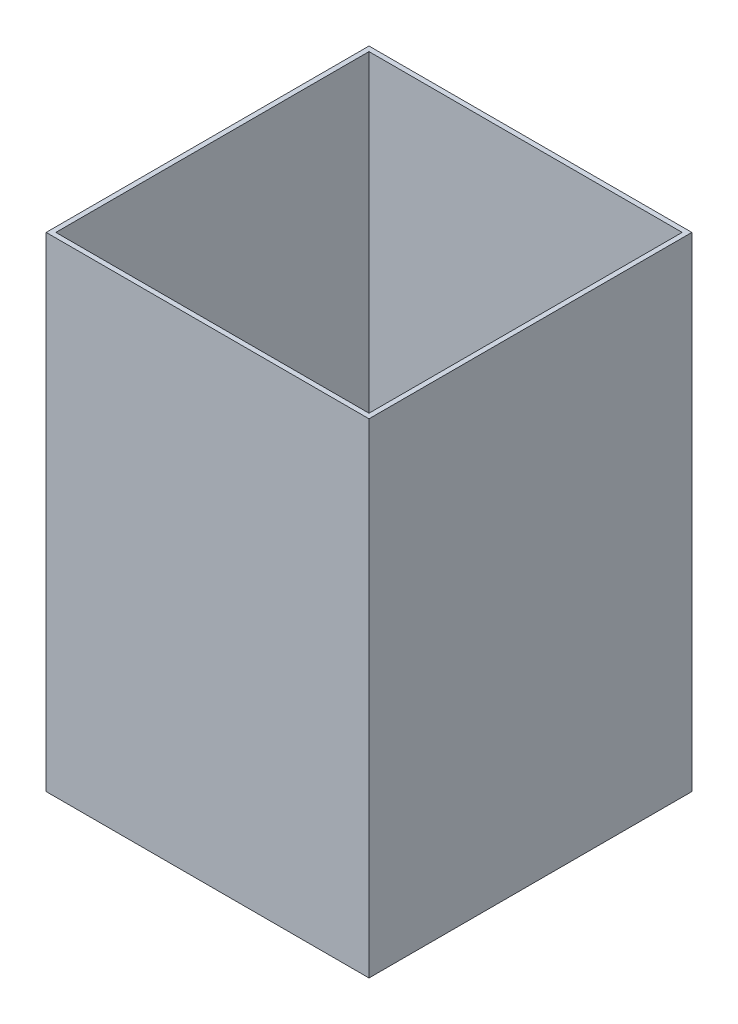
ISO-10303-21;
HEADER;
FILE_DESCRIPTION(('STEP AP214'),'2;1');
FILE_NAME('part.step','',(''),(''),'','','');
FILE_SCHEMA(('AUTOMOTIVE_DESIGN { 1 0 10303 214 1 1 1 1 }'));
ENDSEC;
DATA;
#1=APPLICATION_CONTEXT('core data for automotive mechanical design processes');
#2=APPLICATION_PROTOCOL_DEFINITION('international standard','automotive_design',2000,#1);
#3=PRODUCT_CONTEXT('',#1,'mechanical');
#4=PRODUCT('Part','Part','',(#3));
#5=PRODUCT_RELATED_PRODUCT_CATEGORY('part','',(#4));
#6=PRODUCT_DEFINITION_FORMATION('','',#4);
#7=PRODUCT_DEFINITION_CONTEXT('part definition',#1,'design');
#8=PRODUCT_DEFINITION('design','',#6,#7);
#9=PRODUCT_DEFINITION_SHAPE('','',#8);
#10=(LENGTH_UNIT() NAMED_UNIT(*) SI_UNIT(.MILLI.,.METRE.));
#11=(NAMED_UNIT(*) PLANE_ANGLE_UNIT() SI_UNIT($,.RADIAN.));
#12=(NAMED_UNIT(*) SI_UNIT($,.STERADIAN.) SOLID_ANGLE_UNIT());
#13=UNCERTAINTY_MEASURE_WITH_UNIT(LENGTH_MEASURE(1.E-05),#10,'distance_accuracy_value','');
#14=(GEOMETRIC_REPRESENTATION_CONTEXT(3) GLOBAL_UNCERTAINTY_ASSIGNED_CONTEXT((#13)) GLOBAL_UNIT_ASSIGNED_CONTEXT((#10,
#11,#12)) REPRESENTATION_CONTEXT('',''));
#15=CARTESIAN_POINT('',(0.,0.,0.));
#16=DIRECTION('',(0.,0.,1.));
#17=DIRECTION('',(1.,0.,0.));
#18=AXIS2_PLACEMENT_3D('',#15,#16,#17);
#19=CARTESIAN_POINT('',(0.,150.,0.));
#20=DIRECTION('',(0.,-1.,0.));
#21=DIRECTION('',(0.,0.,-1.));
#22=AXIS2_PLACEMENT_3D('',#19,#20,#21);
#23=PLANE('',#22);
#24=DIRECTION('',(0.,0.,-1.));
#25=VECTOR('',#24,1.);
#26=CARTESIAN_POINT('',(50.,150.,50.));
#27=LINE('',#26,#25);
#28=CARTESIAN_POINT('',(50.,150.,50.));
#29=VERTEX_POINT('',#28);
#30=CARTESIAN_POINT('',(50.,150.,-50.));
#31=VERTEX_POINT('',#30);
#32=EDGE_CURVE('E133',#29,#31,#27,.T.);
#33=ORIENTED_EDGE('',*,*,#32,.T.);
#34=DIRECTION('',(-1.,0.,0.));
#35=VECTOR('',#34,1.);
#36=CARTESIAN_POINT('',(-50.,150.,-50.));
#37=LINE('',#36,#35);
#38=CARTESIAN_POINT('',(-50.,150.,-50.));
#39=VERTEX_POINT('',#38);
#40=EDGE_CURVE('E136',#31,#39,#37,.T.);
#41=ORIENTED_EDGE('',*,*,#40,.T.);
#42=DIRECTION('',(0.,0.,1.));
#43=VECTOR('',#42,1.);
#44=CARTESIAN_POINT('',(-50.,150.,50.));
#45=LINE('',#44,#43);
#46=CARTESIAN_POINT('',(-50.,150.,50.));
#47=VERTEX_POINT('',#46);
#48=EDGE_CURVE('E139',#39,#47,#45,.T.);
#49=ORIENTED_EDGE('',*,*,#48,.T.);
#50=DIRECTION('',(1.,0.,0.));
#51=VECTOR('',#50,1.);
#52=CARTESIAN_POINT('',(-50.,150.,50.));
#53=LINE('',#52,#51);
#54=EDGE_CURVE('E141',#47,#29,#53,.T.);
#55=ORIENTED_EDGE('',*,*,#54,.T.);
#56=EDGE_LOOP('',(#33,#41,#49,#55));
#57=FACE_BOUND('',#56,.T.);
#58=DIRECTION('',(0.,0.,-1.));
#59=VECTOR('',#58,1.);
#60=CARTESIAN_POINT('',(48.5,150.,-48.5));
#61=LINE('',#60,#59);
#62=CARTESIAN_POINT('',(48.5,150.,48.5));
#63=VERTEX_POINT('',#62);
#64=CARTESIAN_POINT('',(48.5,150.,-48.5));
#65=VERTEX_POINT('',#64);
#66=EDGE_CURVE('E97',#63,#65,#61,.T.);
#67=ORIENTED_EDGE('',*,*,#66,.F.);
#68=DIRECTION('',(1.,0.,0.));
#69=VECTOR('',#68,1.);
#70=CARTESIAN_POINT('',(-48.5,150.,48.5));
#71=LINE('',#70,#69);
#72=CARTESIAN_POINT('',(-48.5,150.,48.5));
#73=VERTEX_POINT('',#72);
#74=EDGE_CURVE('E119',#73,#63,#71,.T.);
#75=ORIENTED_EDGE('',*,*,#74,.F.);
#76=DIRECTION('',(0.,0.,1.));
#77=VECTOR('',#76,1.);
#78=CARTESIAN_POINT('',(-48.5,150.,-48.5));
#79=LINE('',#78,#77);
#80=CARTESIAN_POINT('',(-48.5,150.,-48.5));
#81=VERTEX_POINT('',#80);
#82=EDGE_CURVE('E117',#81,#73,#79,.T.);
#83=ORIENTED_EDGE('',*,*,#82,.F.);
#84=DIRECTION('',(-1.,0.,0.));
#85=VECTOR('',#84,1.);
#86=CARTESIAN_POINT('',(-48.5,150.,-48.5));
#87=LINE('',#86,#85);
#88=EDGE_CURVE('E105',#65,#81,#87,.T.);
#89=ORIENTED_EDGE('',*,*,#88,.F.);
#90=EDGE_LOOP('',(#67,#75,#83,#89));
#91=FACE_BOUND('',#90,.T.);
#92=ADVANCED_FACE('F32',(#57,#91),#23,.F.);
#93=CARTESIAN_POINT('',(0.,0.,0.));
#94=DIRECTION('',(0.,-1.,0.));
#95=DIRECTION('',(0.,0.,-1.));
#96=AXIS2_PLACEMENT_3D('',#93,#94,#95);
#97=PLANE('',#96);
#98=DIRECTION('',(0.,0.,-1.));
#99=VECTOR('',#98,1.);
#100=CARTESIAN_POINT('',(50.,0.,50.));
#101=LINE('',#100,#99);
#102=CARTESIAN_POINT('',(50.,0.,50.));
#103=VERTEX_POINT('',#102);
#104=CARTESIAN_POINT('',(50.,0.,-50.));
#105=VERTEX_POINT('',#104);
#106=EDGE_CURVE('E113',#103,#105,#101,.T.);
#107=ORIENTED_EDGE('',*,*,#106,.F.);
#108=DIRECTION('',(1.,0.,0.));
#109=VECTOR('',#108,1.);
#110=CARTESIAN_POINT('',(-50.,0.,50.));
#111=LINE('',#110,#109);
#112=CARTESIAN_POINT('',(-50.,0.,50.));
#113=VERTEX_POINT('',#112);
#114=EDGE_CURVE('E137',#113,#103,#111,.T.);
#115=ORIENTED_EDGE('',*,*,#114,.F.);
#116=DIRECTION('',(0.,0.,1.));
#117=VECTOR('',#116,1.);
#118=CARTESIAN_POINT('',(-50.,0.,50.));
#119=LINE('',#118,#117);
#120=CARTESIAN_POINT('',(-50.,0.,-50.));
#121=VERTEX_POINT('',#120);
#122=EDGE_CURVE('E148',#121,#113,#119,.T.);
#123=ORIENTED_EDGE('',*,*,#122,.F.);
#124=DIRECTION('',(-1.,0.,0.));
#125=VECTOR('',#124,1.);
#126=CARTESIAN_POINT('',(-50.,0.,-50.));
#127=LINE('',#126,#125);
#128=EDGE_CURVE('E146',#105,#121,#127,.T.);
#129=ORIENTED_EDGE('',*,*,#128,.F.);
#130=EDGE_LOOP('',(#107,#115,#123,#129));
#131=FACE_BOUND('',#130,.T.);
#132=DIRECTION('',(1.,0.,0.));
#133=VECTOR('',#132,1.);
#134=CARTESIAN_POINT('',(-48.5,0.,48.5));
#135=LINE('',#134,#133);
#136=CARTESIAN_POINT('',(-48.5,0.,48.5));
#137=VERTEX_POINT('',#136);
#138=CARTESIAN_POINT('',(48.5,0.,48.5));
#139=VERTEX_POINT('',#138);
#140=EDGE_CURVE('E106',#137,#139,#135,.T.);
#141=ORIENTED_EDGE('',*,*,#140,.T.);
#142=DIRECTION('',(0.,0.,-1.));
#143=VECTOR('',#142,1.);
#144=CARTESIAN_POINT('',(48.5,0.,-48.5));
#145=LINE('',#144,#143);
#146=CARTESIAN_POINT('',(48.5,0.,-48.5));
#147=VERTEX_POINT('',#146);
#148=EDGE_CURVE('E55',#139,#147,#145,.T.);
#149=ORIENTED_EDGE('',*,*,#148,.T.);
#150=DIRECTION('',(-1.,0.,0.));
#151=VECTOR('',#150,1.);
#152=CARTESIAN_POINT('',(-48.5,0.,-48.5));
#153=LINE('',#152,#151);
#154=CARTESIAN_POINT('',(-48.5,0.,-48.5));
#155=VERTEX_POINT('',#154);
#156=EDGE_CURVE('E112',#147,#155,#153,.T.);
#157=ORIENTED_EDGE('',*,*,#156,.T.);
#158=DIRECTION('',(0.,0.,1.));
#159=VECTOR('',#158,1.);
#160=CARTESIAN_POINT('',(-48.5,0.,-48.5));
#161=LINE('',#160,#159);
#162=EDGE_CURVE('E125',#155,#137,#161,.T.);
#163=ORIENTED_EDGE('',*,*,#162,.T.);
#164=EDGE_LOOP('',(#141,#149,#157,#163));
#165=FACE_BOUND('',#164,.T.);
#166=ADVANCED_FACE('F166',(#131,#165),#97,.T.);
#167=CARTESIAN_POINT('',(50.,150.,50.));
#168=DIRECTION('',(-1.,0.,0.));
#169=DIRECTION('',(0.,0.,1.));
#170=AXIS2_PLACEMENT_3D('',#167,#168,#169);
#171=PLANE('',#170);
#172=ORIENTED_EDGE('',*,*,#106,.T.);
#173=DIRECTION('',(0.,-1.,0.));
#174=VECTOR('',#173,1.);
#175=CARTESIAN_POINT('',(50.,150.,-50.));
#176=LINE('',#175,#174);
#177=EDGE_CURVE('E11',#31,#105,#176,.T.);
#178=ORIENTED_EDGE('',*,*,#177,.F.);
#179=ORIENTED_EDGE('',*,*,#32,.F.);
#180=DIRECTION('',(0.,-1.,0.));
#181=VECTOR('',#180,1.);
#182=CARTESIAN_POINT('',(50.,150.,50.));
#183=LINE('',#182,#181);
#184=EDGE_CURVE('E143',#29,#103,#183,.T.);
#185=ORIENTED_EDGE('',*,*,#184,.T.);
#186=EDGE_LOOP('',(#172,#178,#179,#185));
#187=FACE_BOUND('',#186,.T.);
#188=ADVANCED_FACE('F34',(#187),#171,.F.);
#189=CARTESIAN_POINT('',(-50.,150.,-50.));
#190=DIRECTION('',(0.,0.,1.));
#191=DIRECTION('',(1.,0.,0.));
#192=AXIS2_PLACEMENT_3D('',#189,#190,#191);
#193=PLANE('',#192);
#194=ORIENTED_EDGE('',*,*,#128,.T.);
#195=DIRECTION('',(0.,-1.,0.));
#196=VECTOR('',#195,1.);
#197=CARTESIAN_POINT('',(-50.,150.,-50.));
#198=LINE('',#197,#196);
#199=EDGE_CURVE('E40',#39,#121,#198,.T.);
#200=ORIENTED_EDGE('',*,*,#199,.F.);
#201=ORIENTED_EDGE('',*,*,#40,.F.);
#202=ORIENTED_EDGE('',*,*,#177,.T.);
#203=EDGE_LOOP('',(#194,#200,#201,#202));
#204=FACE_BOUND('',#203,.T.);
#205=ADVANCED_FACE('F176',(#204),#193,.F.);
#206=CARTESIAN_POINT('',(-50.,150.,50.));
#207=DIRECTION('',(1.,0.,0.));
#208=DIRECTION('',(0.,0.,-1.));
#209=AXIS2_PLACEMENT_3D('',#206,#207,#208);
#210=PLANE('',#209);
#211=ORIENTED_EDGE('',*,*,#122,.T.);
#212=DIRECTION('',(0.,-1.,0.));
#213=VECTOR('',#212,1.);
#214=CARTESIAN_POINT('',(-50.,150.,50.));
#215=LINE('',#214,#213);
#216=EDGE_CURVE('E153',#47,#113,#215,.T.);
#217=ORIENTED_EDGE('',*,*,#216,.F.);
#218=ORIENTED_EDGE('',*,*,#48,.F.);
#219=ORIENTED_EDGE('',*,*,#199,.T.);
#220=EDGE_LOOP('',(#211,#217,#218,#219));
#221=FACE_BOUND('',#220,.T.);
#222=ADVANCED_FACE('F160',(#221),#210,.F.);
#223=CARTESIAN_POINT('',(-50.,150.,50.));
#224=DIRECTION('',(0.,0.,-1.));
#225=DIRECTION('',(-1.,0.,0.));
#226=AXIS2_PLACEMENT_3D('',#223,#224,#225);
#227=PLANE('',#226);
#228=ORIENTED_EDGE('',*,*,#114,.T.);
#229=ORIENTED_EDGE('',*,*,#184,.F.);
#230=ORIENTED_EDGE('',*,*,#54,.F.);
#231=ORIENTED_EDGE('',*,*,#216,.T.);
#232=EDGE_LOOP('',(#228,#229,#230,#231));
#233=FACE_BOUND('',#232,.T.);
#234=ADVANCED_FACE('F170',(#233),#227,.F.);
#235=CARTESIAN_POINT('',(48.5,150.,-48.5));
#236=DIRECTION('',(-1.,0.,0.));
#237=DIRECTION('',(0.,0.,1.));
#238=AXIS2_PLACEMENT_3D('',#235,#236,#237);
#239=PLANE('',#238);
#240=ORIENTED_EDGE('',*,*,#148,.F.);
#241=DIRECTION('',(0.,-1.,0.));
#242=VECTOR('',#241,1.);
#243=CARTESIAN_POINT('',(48.5,150.,48.5));
#244=LINE('',#243,#242);
#245=EDGE_CURVE('E101',#63,#139,#244,.T.);
#246=ORIENTED_EDGE('',*,*,#245,.F.);
#247=ORIENTED_EDGE('',*,*,#66,.T.);
#248=DIRECTION('',(0.,-1.,0.));
#249=VECTOR('',#248,1.);
#250=CARTESIAN_POINT('',(48.5,150.,-48.5));
#251=LINE('',#250,#249);
#252=EDGE_CURVE('E100',#65,#147,#251,.T.);
#253=ORIENTED_EDGE('',*,*,#252,.T.);
#254=EDGE_LOOP('',(#240,#246,#247,#253));
#255=FACE_BOUND('',#254,.T.);
#256=ADVANCED_FACE('F99',(#255),#239,.T.);
#257=CARTESIAN_POINT('',(-48.5,150.,-48.5));
#258=DIRECTION('',(0.,0.,1.));
#259=DIRECTION('',(1.,0.,0.));
#260=AXIS2_PLACEMENT_3D('',#257,#258,#259);
#261=PLANE('',#260);
#262=ORIENTED_EDGE('',*,*,#156,.F.);
#263=ORIENTED_EDGE('',*,*,#252,.F.);
#264=ORIENTED_EDGE('',*,*,#88,.T.);
#265=DIRECTION('',(0.,-1.,0.));
#266=VECTOR('',#265,1.);
#267=CARTESIAN_POINT('',(-48.5,150.,-48.5));
#268=LINE('',#267,#266);
#269=EDGE_CURVE('E114',#81,#155,#268,.T.);
#270=ORIENTED_EDGE('',*,*,#269,.T.);
#271=EDGE_LOOP('',(#262,#263,#264,#270));
#272=FACE_BOUND('',#271,.T.);
#273=ADVANCED_FACE('F109',(#272),#261,.T.);
#274=CARTESIAN_POINT('',(-48.5,150.,-48.5));
#275=DIRECTION('',(1.,0.,0.));
#276=DIRECTION('',(0.,0.,-1.));
#277=AXIS2_PLACEMENT_3D('',#274,#275,#276);
#278=PLANE('',#277);
#279=ORIENTED_EDGE('',*,*,#162,.F.);
#280=ORIENTED_EDGE('',*,*,#269,.F.);
#281=ORIENTED_EDGE('',*,*,#82,.T.);
#282=DIRECTION('',(0.,-1.,0.));
#283=VECTOR('',#282,1.);
#284=CARTESIAN_POINT('',(-48.5,150.,48.5));
#285=LINE('',#284,#283);
#286=EDGE_CURVE('E47',#73,#137,#285,.T.);
#287=ORIENTED_EDGE('',*,*,#286,.T.);
#288=EDGE_LOOP('',(#279,#280,#281,#287));
#289=FACE_BOUND('',#288,.T.);
#290=ADVANCED_FACE('F199',(#289),#278,.T.);
#291=CARTESIAN_POINT('',(-48.5,150.,48.5));
#292=DIRECTION('',(0.,0.,-1.));
#293=DIRECTION('',(-1.,0.,0.));
#294=AXIS2_PLACEMENT_3D('',#291,#292,#293);
#295=PLANE('',#294);
#296=ORIENTED_EDGE('',*,*,#140,.F.);
#297=ORIENTED_EDGE('',*,*,#286,.F.);
#298=ORIENTED_EDGE('',*,*,#74,.T.);
#299=ORIENTED_EDGE('',*,*,#245,.T.);
#300=EDGE_LOOP('',(#296,#297,#298,#299));
#301=FACE_BOUND('',#300,.T.);
#302=ADVANCED_FACE('F203',(#301),#295,.T.);
#303=CLOSED_SHELL('',(#92,#166,#188,#205,#222,#234,#256,#273,#290,#302));
#304=MANIFOLD_SOLID_BREP('B2',#303);
#305=ADVANCED_BREP_SHAPE_REPRESENTATION('',(#18,#304),#14);
#306=SHAPE_DEFINITION_REPRESENTATION(#9,#305);
ENDSEC;
END-ISO-10303-21;
